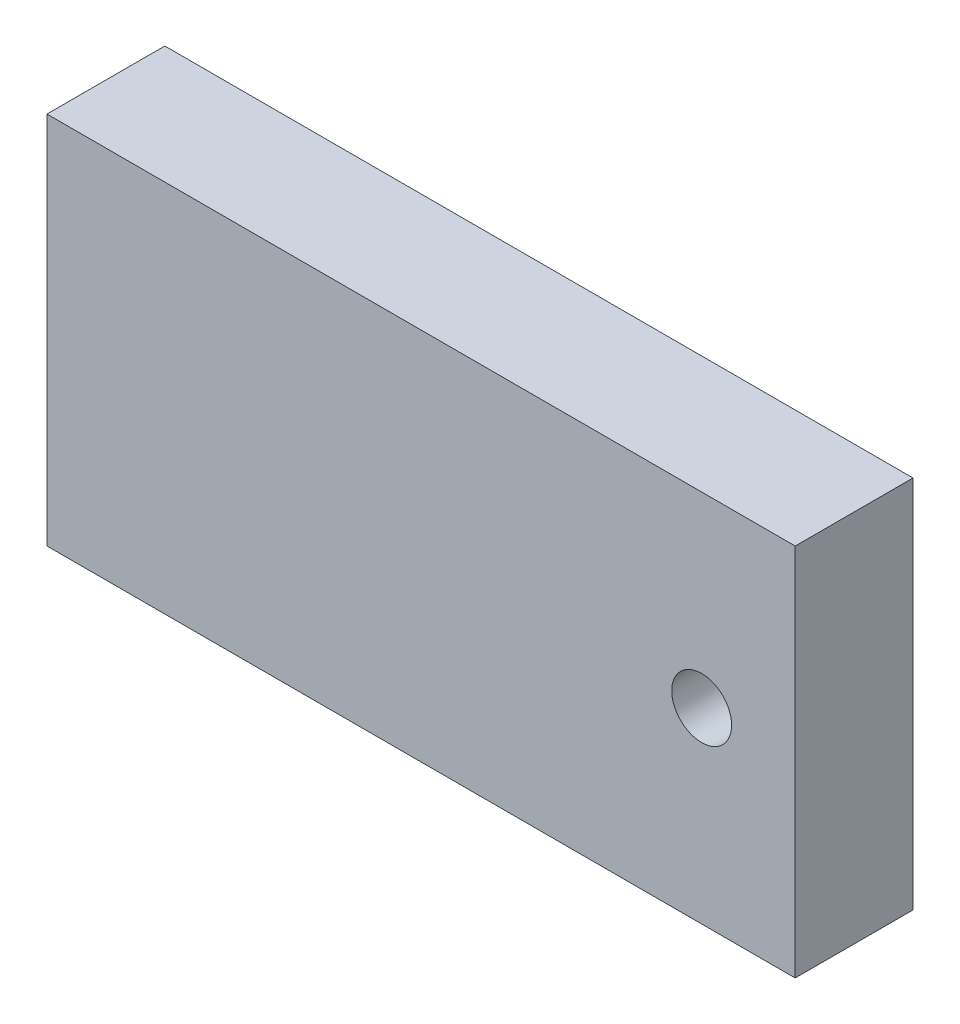
ISO-10303-21;
HEADER;
FILE_DESCRIPTION(('STEP AP214'),'2;1');
FILE_NAME('part.step','',(''),(''),'','','');
FILE_SCHEMA(('AUTOMOTIVE_DESIGN { 1 0 10303 214 1 1 1 1 }'));
ENDSEC;
DATA;
#1=APPLICATION_CONTEXT('core data for automotive mechanical design processes');
#2=APPLICATION_PROTOCOL_DEFINITION('international standard','automotive_design',2000,#1);
#3=PRODUCT_CONTEXT('',#1,'mechanical');
#4=PRODUCT('Part','Part','',(#3));
#5=PRODUCT_RELATED_PRODUCT_CATEGORY('part','',(#4));
#6=PRODUCT_DEFINITION_FORMATION('','',#4);
#7=PRODUCT_DEFINITION_CONTEXT('part definition',#1,'design');
#8=PRODUCT_DEFINITION('design','',#6,#7);
#9=PRODUCT_DEFINITION_SHAPE('','',#8);
#10=(LENGTH_UNIT() NAMED_UNIT(*) SI_UNIT(.MILLI.,.METRE.));
#11=(NAMED_UNIT(*) PLANE_ANGLE_UNIT() SI_UNIT($,.RADIAN.));
#12=(NAMED_UNIT(*) SI_UNIT($,.STERADIAN.) SOLID_ANGLE_UNIT());
#13=UNCERTAINTY_MEASURE_WITH_UNIT(LENGTH_MEASURE(1.E-05),#10,'distance_accuracy_value','');
#14=(GEOMETRIC_REPRESENTATION_CONTEXT(3) GLOBAL_UNCERTAINTY_ASSIGNED_CONTEXT((#13)) GLOBAL_UNIT_ASSIGNED_CONTEXT((#10,
#11,#12)) REPRESENTATION_CONTEXT('',''));
#15=CARTESIAN_POINT('',(0.,0.,0.));
#16=DIRECTION('',(0.,0.,1.));
#17=DIRECTION('',(1.,0.,0.));
#18=AXIS2_PLACEMENT_3D('',#15,#16,#17);
#19=CARTESIAN_POINT('',(0.,19.05,6.));
#20=DIRECTION('',(0.,0.,-1.));
#21=DIRECTION('',(-1.,0.,0.));
#22=AXIS2_PLACEMENT_3D('',#19,#20,#21);
#23=PLANE('',#22);
#24=DIRECTION('',(0.,-1.,0.));
#25=VECTOR('',#24,1.);
#26=CARTESIAN_POINT('',(0.,0.,6.));
#27=LINE('',#26,#25);
#28=CARTESIAN_POINT('',(0.,19.05,6.));
#29=VERTEX_POINT('',#28);
#30=CARTESIAN_POINT('',(0.,0.,6.));
#31=VERTEX_POINT('',#30);
#32=EDGE_CURVE('E84',#29,#31,#27,.T.);
#33=ORIENTED_EDGE('',*,*,#32,.T.);
#34=DIRECTION('',(1.,0.,0.));
#35=VECTOR('',#34,1.);
#36=CARTESIAN_POINT('',(0.,0.,6.));
#37=LINE('',#36,#35);
#38=CARTESIAN_POINT('',(38.1,0.,6.));
#39=VERTEX_POINT('',#38);
#40=EDGE_CURVE('E79',#31,#39,#37,.T.);
#41=ORIENTED_EDGE('',*,*,#40,.T.);
#42=DIRECTION('',(0.,1.,0.));
#43=VECTOR('',#42,1.);
#44=CARTESIAN_POINT('',(38.1,0.,6.));
#45=LINE('',#44,#43);
#46=CARTESIAN_POINT('',(38.1,19.05,6.));
#47=VERTEX_POINT('',#46);
#48=EDGE_CURVE('E82',#39,#47,#45,.T.);
#49=ORIENTED_EDGE('',*,*,#48,.T.);
#50=DIRECTION('',(-1.,0.,0.));
#51=VECTOR('',#50,1.);
#52=CARTESIAN_POINT('',(0.,19.05,6.));
#53=LINE('',#52,#51);
#54=EDGE_CURVE('E49',#47,#29,#53,.T.);
#55=ORIENTED_EDGE('',*,*,#54,.T.);
#56=EDGE_LOOP('',(#33,#41,#49,#55));
#57=FACE_BOUND('',#56,.T.);
#58=CARTESIAN_POINT('',(33.3375,9.525,6.));
#59=DIRECTION('',(0.,0.,1.));
#60=DIRECTION('',(1.,0.,0.));
#61=AXIS2_PLACEMENT_3D('',#58,#59,#60);
#62=CIRCLE('',#61,1.524);
#63=CARTESIAN_POINT('',(34.8615,9.525,6.));
#64=VERTEX_POINT('',#63);
#65=EDGE_CURVE('E99',#64,#64,#62,.T.);
#66=ORIENTED_EDGE('',*,*,#65,.F.);
#67=EDGE_LOOP('',(#66));
#68=FACE_BOUND('',#67,.T.);
#69=ADVANCED_FACE('F32',(#57,#68),#23,.F.);
#70=CARTESIAN_POINT('',(0.,19.05,0.));
#71=DIRECTION('',(0.,0.,-1.));
#72=DIRECTION('',(-1.,0.,0.));
#73=AXIS2_PLACEMENT_3D('',#70,#71,#72);
#74=PLANE('',#73);
#75=DIRECTION('',(0.,-1.,0.));
#76=VECTOR('',#75,1.);
#77=CARTESIAN_POINT('',(0.,0.,0.));
#78=LINE('',#77,#76);
#79=CARTESIAN_POINT('',(0.,19.05,0.));
#80=VERTEX_POINT('',#79);
#81=CARTESIAN_POINT('',(0.,0.,0.));
#82=VERTEX_POINT('',#81);
#83=EDGE_CURVE('E96',#80,#82,#78,.T.);
#84=ORIENTED_EDGE('',*,*,#83,.F.);
#85=DIRECTION('',(-1.,0.,0.));
#86=VECTOR('',#85,1.);
#87=CARTESIAN_POINT('',(0.,19.05,0.));
#88=LINE('',#87,#86);
#89=CARTESIAN_POINT('',(38.1,19.05,0.));
#90=VERTEX_POINT('',#89);
#91=EDGE_CURVE('E72',#90,#80,#88,.T.);
#92=ORIENTED_EDGE('',*,*,#91,.F.);
#93=DIRECTION('',(0.,1.,0.));
#94=VECTOR('',#93,1.);
#95=CARTESIAN_POINT('',(38.1,0.,0.));
#96=LINE('',#95,#94);
#97=CARTESIAN_POINT('',(38.1,0.,0.));
#98=VERTEX_POINT('',#97);
#99=EDGE_CURVE('E66',#98,#90,#96,.T.);
#100=ORIENTED_EDGE('',*,*,#99,.F.);
#101=DIRECTION('',(1.,0.,0.));
#102=VECTOR('',#101,1.);
#103=CARTESIAN_POINT('',(0.,0.,0.));
#104=LINE('',#103,#102);
#105=EDGE_CURVE('E88',#82,#98,#104,.T.);
#106=ORIENTED_EDGE('',*,*,#105,.F.);
#107=EDGE_LOOP('',(#84,#92,#100,#106));
#108=FACE_BOUND('',#107,.T.);
#109=CARTESIAN_POINT('',(33.3375,9.525,0.));
#110=DIRECTION('',(0.,0.,1.));
#111=DIRECTION('',(1.,0.,0.));
#112=AXIS2_PLACEMENT_3D('',#109,#110,#111);
#113=CIRCLE('',#112,1.524);
#114=CARTESIAN_POINT('',(34.8615,9.525,0.));
#115=VERTEX_POINT('',#114);
#116=EDGE_CURVE('E111',#115,#115,#113,.T.);
#117=ORIENTED_EDGE('',*,*,#116,.T.);
#118=EDGE_LOOP('',(#117));
#119=FACE_BOUND('',#118,.T.);
#120=ADVANCED_FACE('F107',(#108,#119),#74,.T.);
#121=CARTESIAN_POINT('',(0.,0.,6.));
#122=DIRECTION('',(1.,0.,0.));
#123=DIRECTION('',(0.,0.,-1.));
#124=AXIS2_PLACEMENT_3D('',#121,#122,#123);
#125=PLANE('',#124);
#126=ORIENTED_EDGE('',*,*,#83,.T.);
#127=DIRECTION('',(0.,0.,-1.));
#128=VECTOR('',#127,1.);
#129=CARTESIAN_POINT('',(0.,0.,6.));
#130=LINE('',#129,#128);
#131=EDGE_CURVE('E11',#31,#82,#130,.T.);
#132=ORIENTED_EDGE('',*,*,#131,.F.);
#133=ORIENTED_EDGE('',*,*,#32,.F.);
#134=DIRECTION('',(0.,0.,-1.));
#135=VECTOR('',#134,1.);
#136=CARTESIAN_POINT('',(0.,19.05,6.));
#137=LINE('',#136,#135);
#138=EDGE_CURVE('E92',#29,#80,#137,.T.);
#139=ORIENTED_EDGE('',*,*,#138,.T.);
#140=EDGE_LOOP('',(#126,#132,#133,#139));
#141=FACE_BOUND('',#140,.T.);
#142=ADVANCED_FACE('F34',(#141),#125,.F.);
#143=CARTESIAN_POINT('',(0.,0.,6.));
#144=DIRECTION('',(0.,1.,0.));
#145=DIRECTION('',(0.,0.,1.));
#146=AXIS2_PLACEMENT_3D('',#143,#144,#145);
#147=PLANE('',#146);
#148=ORIENTED_EDGE('',*,*,#105,.T.);
#149=DIRECTION('',(0.,0.,-1.));
#150=VECTOR('',#149,1.);
#151=CARTESIAN_POINT('',(38.1,0.,6.));
#152=LINE('',#151,#150);
#153=EDGE_CURVE('E41',#39,#98,#152,.T.);
#154=ORIENTED_EDGE('',*,*,#153,.F.);
#155=ORIENTED_EDGE('',*,*,#40,.F.);
#156=ORIENTED_EDGE('',*,*,#131,.T.);
#157=EDGE_LOOP('',(#148,#154,#155,#156));
#158=FACE_BOUND('',#157,.T.);
#159=ADVANCED_FACE('F87',(#158),#147,.F.);
#160=CARTESIAN_POINT('',(38.1,0.,6.));
#161=DIRECTION('',(-1.,0.,0.));
#162=DIRECTION('',(0.,0.,1.));
#163=AXIS2_PLACEMENT_3D('',#160,#161,#162);
#164=PLANE('',#163);
#165=ORIENTED_EDGE('',*,*,#99,.T.);
#166=DIRECTION('',(0.,0.,-1.));
#167=VECTOR('',#166,1.);
#168=CARTESIAN_POINT('',(38.1,19.05,6.));
#169=LINE('',#168,#167);
#170=EDGE_CURVE('E89',#47,#90,#169,.T.);
#171=ORIENTED_EDGE('',*,*,#170,.F.);
#172=ORIENTED_EDGE('',*,*,#48,.F.);
#173=ORIENTED_EDGE('',*,*,#153,.T.);
#174=EDGE_LOOP('',(#165,#171,#172,#173));
#175=FACE_BOUND('',#174,.T.);
#176=ADVANCED_FACE('F90',(#175),#164,.F.);
#177=CARTESIAN_POINT('',(0.,19.05,6.));
#178=DIRECTION('',(0.,-1.,0.));
#179=DIRECTION('',(0.,0.,-1.));
#180=AXIS2_PLACEMENT_3D('',#177,#178,#179);
#181=PLANE('',#180);
#182=ORIENTED_EDGE('',*,*,#91,.T.);
#183=ORIENTED_EDGE('',*,*,#138,.F.);
#184=ORIENTED_EDGE('',*,*,#54,.F.);
#185=ORIENTED_EDGE('',*,*,#170,.T.);
#186=EDGE_LOOP('',(#182,#183,#184,#185));
#187=FACE_BOUND('',#186,.T.);
#188=ADVANCED_FACE('F104',(#187),#181,.F.);
#189=CARTESIAN_POINT('',(33.3375,9.525,6.));
#190=DIRECTION('',(0.,0.,-1.));
#191=DIRECTION('',(-1.,0.,0.));
#192=AXIS2_PLACEMENT_3D('',#189,#190,#191);
#193=CYLINDRICAL_SURFACE('',#192,1.524);
#194=ORIENTED_EDGE('',*,*,#65,.T.);
#195=EDGE_LOOP('',(#194));
#196=FACE_BOUND('',#195,.T.);
#197=ORIENTED_EDGE('',*,*,#116,.F.);
#198=EDGE_LOOP('',(#197));
#199=FACE_BOUND('',#198,.T.);
#200=ADVANCED_FACE('F117',(#196,#199),#193,.F.);
#201=CLOSED_SHELL('',(#69,#120,#142,#159,#176,#188,#200));
#202=MANIFOLD_SOLID_BREP('B2',#201);
#203=ADVANCED_BREP_SHAPE_REPRESENTATION('',(#18,#202),#14);
#204=SHAPE_DEFINITION_REPRESENTATION(#9,#203);
ENDSEC;
END-ISO-10303-21;
